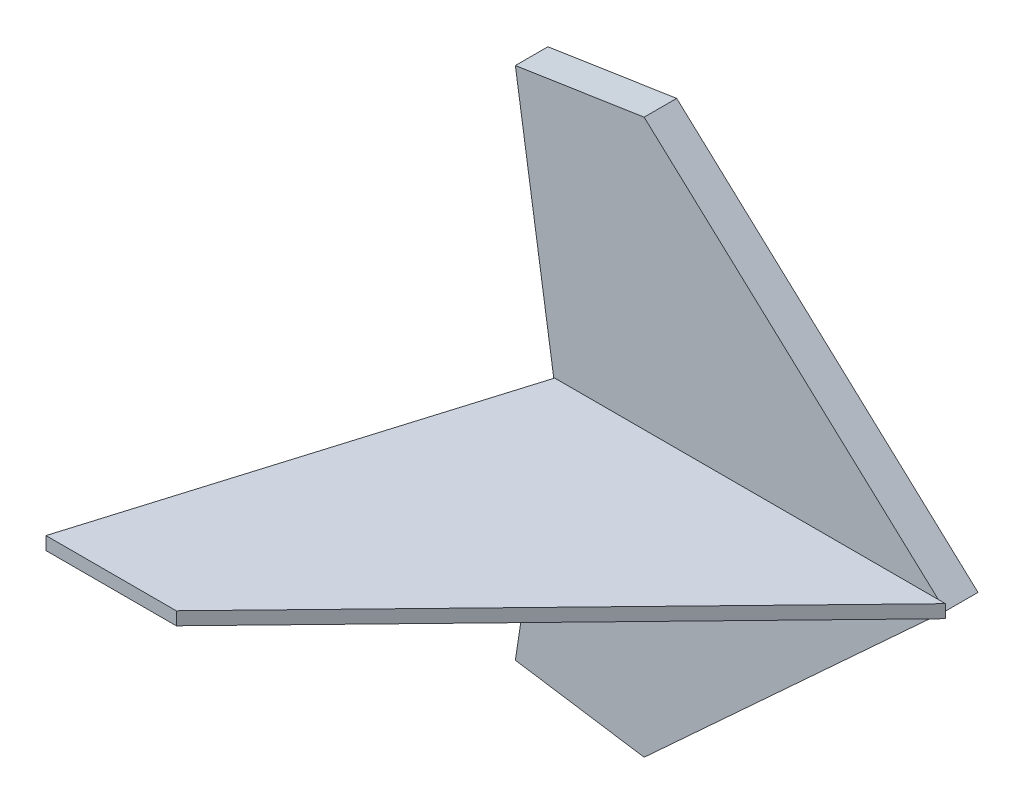
ISO-10303-21;
HEADER;
FILE_DESCRIPTION(('STEP AP214'),'2;1');
FILE_NAME('part.step','',(''),(''),'','','');
FILE_SCHEMA(('AUTOMOTIVE_DESIGN { 1 0 10303 214 1 1 1 1 }'));
ENDSEC;
DATA;
#1=APPLICATION_CONTEXT('core data for automotive mechanical design processes');
#2=APPLICATION_PROTOCOL_DEFINITION('international standard','automotive_design',2000,#1);
#3=PRODUCT_CONTEXT('',#1,'mechanical');
#4=PRODUCT('Part','Part','',(#3));
#5=PRODUCT_RELATED_PRODUCT_CATEGORY('part','',(#4));
#6=PRODUCT_DEFINITION_FORMATION('','',#4);
#7=PRODUCT_DEFINITION_CONTEXT('part definition',#1,'design');
#8=PRODUCT_DEFINITION('design','',#6,#7);
#9=PRODUCT_DEFINITION_SHAPE('','',#8);
#10=(LENGTH_UNIT() NAMED_UNIT(*) SI_UNIT(.MILLI.,.METRE.));
#11=(NAMED_UNIT(*) PLANE_ANGLE_UNIT() SI_UNIT($,.RADIAN.));
#12=(NAMED_UNIT(*) SI_UNIT($,.STERADIAN.) SOLID_ANGLE_UNIT());
#13=UNCERTAINTY_MEASURE_WITH_UNIT(LENGTH_MEASURE(1.E-05),#10,'distance_accuracy_value','');
#14=(GEOMETRIC_REPRESENTATION_CONTEXT(3) GLOBAL_UNCERTAINTY_ASSIGNED_CONTEXT((#13)) GLOBAL_UNIT_ASSIGNED_CONTEXT((#10,
#11,#12)) REPRESENTATION_CONTEXT('',''));
#15=CARTESIAN_POINT('',(0.,0.,0.));
#16=DIRECTION('',(0.,0.,1.));
#17=DIRECTION('',(1.,0.,0.));
#18=AXIS2_PLACEMENT_3D('',#15,#16,#17);
#19=CARTESIAN_POINT('',(-9.05423406871949,0.5,32.5));
#20=DIRECTION('',(0.,0.,-1.));
#21=DIRECTION('',(-1.,0.,0.));
#22=AXIS2_PLACEMENT_3D('',#19,#20,#21);
#23=PLANE('',#22);
#24=DIRECTION('',(1.,0.,0.));
#25=VECTOR('',#24,1.);
#26=CARTESIAN_POINT('',(-9.05423406871949,-0.5,32.5));
#27=LINE('',#26,#25);
#28=CARTESIAN_POINT('',(-9.05423406871949,-0.5,32.5));
#29=VERTEX_POINT('',#28);
#30=CARTESIAN_POINT('',(0.945765931280507,-0.5,32.5));
#31=VERTEX_POINT('',#30);
#32=EDGE_CURVE('E109',#29,#31,#27,.T.);
#33=ORIENTED_EDGE('',*,*,#32,.T.);
#34=DIRECTION('',(0.,-1.,0.));
#35=VECTOR('',#34,1.);
#36=CARTESIAN_POINT('',(0.945765931280507,0.5,32.5));
#37=LINE('',#36,#35);
#38=CARTESIAN_POINT('',(0.945765931280507,0.5,32.5));
#39=VERTEX_POINT('',#38);
#40=EDGE_CURVE('E12',#39,#31,#37,.T.);
#41=ORIENTED_EDGE('',*,*,#40,.F.);
#42=DIRECTION('',(1.,0.,0.));
#43=VECTOR('',#42,1.);
#44=CARTESIAN_POINT('',(-9.05423406871949,0.5,32.5));
#45=LINE('',#44,#43);
#46=CARTESIAN_POINT('',(-9.05423406871949,0.5,32.5));
#47=VERTEX_POINT('',#46);
#48=EDGE_CURVE('E97',#47,#39,#45,.T.);
#49=ORIENTED_EDGE('',*,*,#48,.F.);
#50=DIRECTION('',(0.,-1.,0.));
#51=VECTOR('',#50,1.);
#52=CARTESIAN_POINT('',(-9.05423406871949,0.5,32.5));
#53=LINE('',#52,#51);
#54=EDGE_CURVE('E105',#47,#29,#53,.T.);
#55=ORIENTED_EDGE('',*,*,#54,.T.);
#56=EDGE_LOOP('',(#33,#41,#49,#55));
#57=FACE_BOUND('',#56,.T.);
#58=ADVANCED_FACE('F46',(#57),#23,.F.);
#59=CARTESIAN_POINT('',(0.945765931280507,0.5,32.5));
#60=DIRECTION('',(-0.718339128041182,0.,-0.695693105560946));
#61=DIRECTION('',(-0.695693105560946,0.,0.718339128041182));
#62=AXIS2_PLACEMENT_3D('',#59,#60,#61);
#63=PLANE('',#62);
#64=DIRECTION('',(0.695693105560946,0.,-0.718339128041182));
#65=VECTOR('',#64,1.);
#66=CARTESIAN_POINT('',(0.945765931280507,-0.5,32.5));
#67=LINE('',#66,#65);
#68=CARTESIAN_POINT('',(30.,-0.5,2.5));
#69=VERTEX_POINT('',#68);
#70=EDGE_CURVE('E101',#31,#69,#67,.T.);
#71=ORIENTED_EDGE('',*,*,#70,.T.);
#72=DIRECTION('',(0.,-1.,0.));
#73=VECTOR('',#72,1.);
#74=CARTESIAN_POINT('',(30.,0.5,2.5));
#75=LINE('',#74,#73);
#76=CARTESIAN_POINT('',(30.,0.5,2.5));
#77=VERTEX_POINT('',#76);
#78=EDGE_CURVE('E54',#77,#69,#75,.T.);
#79=ORIENTED_EDGE('',*,*,#78,.F.);
#80=DIRECTION('',(0.695693105560946,0.,-0.718339128041182));
#81=VECTOR('',#80,1.);
#82=CARTESIAN_POINT('',(0.945765931280507,0.5,32.5));
#83=LINE('',#82,#81);
#84=EDGE_CURVE('E92',#39,#77,#83,.T.);
#85=ORIENTED_EDGE('',*,*,#84,.F.);
#86=ORIENTED_EDGE('',*,*,#40,.T.);
#87=EDGE_LOOP('',(#71,#79,#85,#86));
#88=FACE_BOUND('',#87,.T.);
#89=ADVANCED_FACE('F100',(#88),#63,.F.);
#90=CARTESIAN_POINT('',(0.,0.5,2.5));
#91=DIRECTION('',(0.,0.,1.));
#92=DIRECTION('',(1.,0.,0.));
#93=AXIS2_PLACEMENT_3D('',#90,#91,#92);
#94=PLANE('',#93);
#95=DIRECTION('',(-1.,0.,0.));
#96=VECTOR('',#95,1.);
#97=CARTESIAN_POINT('',(0.,-0.5,2.5));
#98=LINE('',#97,#96);
#99=CARTESIAN_POINT('',(0.,-0.5,2.5));
#100=VERTEX_POINT('',#99);
#101=EDGE_CURVE('E79',#69,#100,#98,.T.);
#102=ORIENTED_EDGE('',*,*,#101,.T.);
#103=DIRECTION('',(0.,-1.,0.));
#104=VECTOR('',#103,1.);
#105=CARTESIAN_POINT('',(0.,0.5,2.5));
#106=LINE('',#105,#104);
#107=CARTESIAN_POINT('',(0.,0.5,2.5));
#108=VERTEX_POINT('',#107);
#109=EDGE_CURVE('E102',#108,#100,#106,.T.);
#110=ORIENTED_EDGE('',*,*,#109,.F.);
#111=DIRECTION('',(-1.,0.,0.));
#112=VECTOR('',#111,1.);
#113=CARTESIAN_POINT('',(0.,0.5,2.5));
#114=LINE('',#113,#112);
#115=EDGE_CURVE('E95',#77,#108,#114,.T.);
#116=ORIENTED_EDGE('',*,*,#115,.F.);
#117=ORIENTED_EDGE('',*,*,#78,.T.);
#118=EDGE_LOOP('',(#102,#110,#116,#117));
#119=FACE_BOUND('',#118,.T.);
#120=ADVANCED_FACE('F103',(#119),#94,.F.);
#121=CARTESIAN_POINT('',(-9.05423406871949,0.5,32.5));
#122=DIRECTION('',(0.957348630533476,0.,0.288935286207272));
#123=DIRECTION('',(0.288935286207272,0.,-0.957348630533476));
#124=AXIS2_PLACEMENT_3D('',#121,#122,#123);
#125=PLANE('',#124);
#126=DIRECTION('',(-0.288935286207272,0.,0.957348630533476));
#127=VECTOR('',#126,1.);
#128=CARTESIAN_POINT('',(-9.05423406871949,-0.5,32.5));
#129=LINE('',#128,#127);
#130=EDGE_CURVE('E85',#100,#29,#129,.T.);
#131=ORIENTED_EDGE('',*,*,#130,.T.);
#132=ORIENTED_EDGE('',*,*,#54,.F.);
#133=DIRECTION('',(-0.288935286207272,0.,0.957348630533476));
#134=VECTOR('',#133,1.);
#135=CARTESIAN_POINT('',(-9.05423406871949,0.5,32.5));
#136=LINE('',#135,#134);
#137=EDGE_CURVE('E62',#108,#47,#136,.T.);
#138=ORIENTED_EDGE('',*,*,#137,.F.);
#139=ORIENTED_EDGE('',*,*,#109,.T.);
#140=EDGE_LOOP('',(#131,#132,#138,#139));
#141=FACE_BOUND('',#140,.T.);
#142=ADVANCED_FACE('F116',(#141),#125,.F.);
#143=CARTESIAN_POINT('',(0.,0.5,0.));
#144=DIRECTION('',(0.,1.,0.));
#145=DIRECTION('',(0.,0.,1.));
#146=AXIS2_PLACEMENT_3D('',#143,#144,#145);
#147=PLANE('',#146);
#148=ORIENTED_EDGE('',*,*,#48,.T.);
#149=ORIENTED_EDGE('',*,*,#84,.T.);
#150=ORIENTED_EDGE('',*,*,#115,.T.);
#151=ORIENTED_EDGE('',*,*,#137,.T.);
#152=EDGE_LOOP('',(#148,#149,#150,#151));
#153=FACE_BOUND('',#152,.T.);
#154=ADVANCED_FACE('F93',(#153),#147,.T.);
#155=CARTESIAN_POINT('',(0.,-0.5,0.));
#156=DIRECTION('',(0.,1.,0.));
#157=DIRECTION('',(0.,0.,1.));
#158=AXIS2_PLACEMENT_3D('',#155,#156,#157);
#159=PLANE('',#158);
#160=ORIENTED_EDGE('',*,*,#32,.F.);
#161=ORIENTED_EDGE('',*,*,#130,.F.);
#162=ORIENTED_EDGE('',*,*,#101,.F.);
#163=ORIENTED_EDGE('',*,*,#70,.F.);
#164=EDGE_LOOP('',(#160,#161,#162,#163));
#165=FACE_BOUND('',#164,.T.);
#166=ADVANCED_FACE('F119',(#165),#159,.F.);
#167=CLOSED_SHELL('',(#58,#89,#120,#142,#154,#166));
#168=MANIFOLD_SOLID_BREP('B2',#167);
#169=CARTESIAN_POINT('',(0.,0.,0.));
#170=DIRECTION('',(0.,0.,1.));
#171=DIRECTION('',(1.,0.,0.));
#172=AXIS2_PLACEMENT_3D('',#169,#170,#171);
#173=PLANE('',#172);
#174=DIRECTION('',(0.7359623733077,-0.677022440599496,0.));
#175=VECTOR('',#174,1.);
#176=CARTESIAN_POINT('',(13.7507815522589,14.9478912649853,0.));
#177=LINE('',#176,#175);
#178=CARTESIAN_POINT('',(6.86740634873216,21.2800077547306,0.));
#179=VERTEX_POINT('',#178);
#180=CARTESIAN_POINT('',(30.,0.,0.));
#181=VERTEX_POINT('',#180);
#182=EDGE_CURVE('E276',#179,#181,#177,.T.);
#183=ORIENTED_EDGE('',*,*,#182,.T.);
#184=DIRECTION('',(0.7359623733077,0.677022440599496,0.));
#185=VECTOR('',#184,1.);
#186=CARTESIAN_POINT('',(13.7507815522589,-14.9478912649853,0.));
#187=LINE('',#186,#185);
#188=CARTESIAN_POINT('',(6.86740634873216,-21.2800077547306,0.));
#189=VERTEX_POINT('',#188);
#190=EDGE_CURVE('E289',#189,#181,#187,.T.);
#191=ORIENTED_EDGE('',*,*,#190,.F.);
#192=DIRECTION('',(0.988548437163866,-0.150903901145325,0.));
#193=VECTOR('',#192,1.);
#194=CARTESIAN_POINT('',(-3.01807802290649,-19.7709687432773,0.));
#195=LINE('',#194,#193);
#196=CARTESIAN_POINT('',(-3.01807802290649,-19.7709687432773,0.));
#197=VERTEX_POINT('',#196);
#198=EDGE_CURVE('E309',#197,#189,#195,.T.);
#199=ORIENTED_EDGE('',*,*,#198,.F.);
#200=DIRECTION('',(-0.150903901145325,-0.988548437163866,0.));
#201=VECTOR('',#200,1.);
#202=CARTESIAN_POINT('',(0.,0.,0.));
#203=LINE('',#202,#201);
#204=CARTESIAN_POINT('',(0.,0.,0.));
#205=VERTEX_POINT('',#204);
#206=EDGE_CURVE('E307',#205,#197,#203,.T.);
#207=ORIENTED_EDGE('',*,*,#206,.F.);
#208=DIRECTION('',(-0.150903901145325,0.988548437163866,0.));
#209=VECTOR('',#208,1.);
#210=CARTESIAN_POINT('',(0.,0.,0.));
#211=LINE('',#210,#209);
#212=CARTESIAN_POINT('',(-3.01807802290649,19.7709687432773,0.));
#213=VERTEX_POINT('',#212);
#214=EDGE_CURVE('E304',#205,#213,#211,.T.);
#215=ORIENTED_EDGE('',*,*,#214,.T.);
#216=DIRECTION('',(0.988548437163866,0.150903901145325,0.));
#217=VECTOR('',#216,1.);
#218=CARTESIAN_POINT('',(-3.01807802290649,19.7709687432773,0.));
#219=LINE('',#218,#217);
#220=EDGE_CURVE('E279',#213,#179,#219,.T.);
#221=ORIENTED_EDGE('',*,*,#220,.T.);
#222=EDGE_LOOP('',(#183,#191,#199,#207,#215,#221));
#223=FACE_BOUND('',#222,.T.);
#224=DIRECTION('',(0.,1.,0.));
#225=VECTOR('',#224,1.);
#226=CARTESIAN_POINT('',(9.99806030040643,0.901972586646871,0.));
#227=LINE('',#226,#225);
#228=CARTESIAN_POINT('',(9.99806030040643,-1.09802741335313,0.));
#229=VERTEX_POINT('',#228);
#230=CARTESIAN_POINT('',(9.99806030040643,0.901972586646871,0.));
#231=VERTEX_POINT('',#230);
#232=EDGE_CURVE('E275',#229,#231,#227,.T.);
#233=ORIENTED_EDGE('',*,*,#232,.F.);
#234=DIRECTION('',(-1.,0.,0.));
#235=VECTOR('',#234,1.);
#236=CARTESIAN_POINT('',(11.9980603004064,-1.09802741335313,0.));
#237=LINE('',#236,#235);
#238=CARTESIAN_POINT('',(11.9980603004064,-1.09802741335313,0.));
#239=VERTEX_POINT('',#238);
#240=EDGE_CURVE('E272',#239,#229,#237,.T.);
#241=ORIENTED_EDGE('',*,*,#240,.F.);
#242=DIRECTION('',(0.,-1.,0.));
#243=VECTOR('',#242,1.);
#244=CARTESIAN_POINT('',(11.9980603004064,0.901972586646871,0.));
#245=LINE('',#244,#243);
#246=CARTESIAN_POINT('',(11.9980603004064,0.901972586646871,0.));
#247=VERTEX_POINT('',#246);
#248=EDGE_CURVE('E199',#247,#239,#245,.T.);
#249=ORIENTED_EDGE('',*,*,#248,.F.);
#250=DIRECTION('',(1.,0.,0.));
#251=VECTOR('',#250,1.);
#252=CARTESIAN_POINT('',(11.9980603004064,0.901972586646871,0.));
#253=LINE('',#252,#251);
#254=EDGE_CURVE('E194',#231,#247,#253,.T.);
#255=ORIENTED_EDGE('',*,*,#254,.F.);
#256=EDGE_LOOP('',(#233,#241,#249,#255));
#257=FACE_BOUND('',#256,.T.);
#258=ADVANCED_FACE('F179',(#223,#257),#173,.F.);
#259=CARTESIAN_POINT('',(13.7507815522589,14.9478912649853,2.5));
#260=DIRECTION('',(0.677022440599496,0.7359623733077,0.));
#261=DIRECTION('',(-0.7359623733077,0.677022440599496,0.));
#262=AXIS2_PLACEMENT_3D('',#259,#260,#261);
#263=PLANE('',#262);
#264=ORIENTED_EDGE('',*,*,#182,.F.);
#265=DIRECTION('',(0.,0.,-1.));
#266=VECTOR('',#265,1.);
#267=CARTESIAN_POINT('',(6.86740634873216,21.2800077547306,2.5));
#268=LINE('',#267,#266);
#269=CARTESIAN_POINT('',(6.86740634873216,21.2800077547306,2.5));
#270=VERTEX_POINT('',#269);
#271=EDGE_CURVE('E44',#270,#179,#268,.T.);
#272=ORIENTED_EDGE('',*,*,#271,.F.);
#273=DIRECTION('',(0.7359623733077,-0.677022440599496,0.));
#274=VECTOR('',#273,1.);
#275=CARTESIAN_POINT('',(13.7507815522589,14.9478912649853,2.5));
#276=LINE('',#275,#274);
#277=CARTESIAN_POINT('',(30.,0.,2.5));
#278=VERTEX_POINT('',#277);
#279=EDGE_CURVE('E285',#270,#278,#276,.T.);
#280=ORIENTED_EDGE('',*,*,#279,.T.);
#281=DIRECTION('',(0.,0.,-1.));
#282=VECTOR('',#281,1.);
#283=CARTESIAN_POINT('',(30.,0.,2.5));
#284=LINE('',#283,#282);
#285=EDGE_CURVE('E300',#278,#181,#284,.T.);
#286=ORIENTED_EDGE('',*,*,#285,.T.);
#287=EDGE_LOOP('',(#264,#272,#280,#286));
#288=FACE_BOUND('',#287,.T.);
#289=ADVANCED_FACE('F181',(#288),#263,.T.);
#290=CARTESIAN_POINT('',(-3.01807802290649,19.7709687432773,2.5));
#291=DIRECTION('',(-0.150903901145325,0.988548437163866,0.));
#292=DIRECTION('',(-0.988548437163866,-0.150903901145325,0.));
#293=AXIS2_PLACEMENT_3D('',#290,#291,#292);
#294=PLANE('',#293);
#295=ORIENTED_EDGE('',*,*,#220,.F.);
#296=DIRECTION('',(0.,0.,-1.));
#297=VECTOR('',#296,1.);
#298=CARTESIAN_POINT('',(-3.01807802290649,19.7709687432773,2.5));
#299=LINE('',#298,#297);
#300=CARTESIAN_POINT('',(-3.01807802290649,19.7709687432773,2.5));
#301=VERTEX_POINT('',#300);
#302=EDGE_CURVE('E187',#301,#213,#299,.T.);
#303=ORIENTED_EDGE('',*,*,#302,.F.);
#304=DIRECTION('',(0.988548437163866,0.150903901145325,0.));
#305=VECTOR('',#304,1.);
#306=CARTESIAN_POINT('',(-3.01807802290649,19.7709687432773,2.5));
#307=LINE('',#306,#305);
#308=EDGE_CURVE('E288',#301,#270,#307,.T.);
#309=ORIENTED_EDGE('',*,*,#308,.T.);
#310=ORIENTED_EDGE('',*,*,#271,.T.);
#311=EDGE_LOOP('',(#295,#303,#309,#310));
#312=FACE_BOUND('',#311,.T.);
#313=ADVANCED_FACE('F328',(#312),#294,.T.);
#314=CARTESIAN_POINT('',(0.,0.,2.5));
#315=DIRECTION('',(-0.988548437163866,-0.150903901145325,0.));
#316=DIRECTION('',(0.150903901145325,-0.988548437163866,0.));
#317=AXIS2_PLACEMENT_3D('',#314,#315,#316);
#318=PLANE('',#317);
#319=ORIENTED_EDGE('',*,*,#214,.F.);
#320=DIRECTION('',(0.,0.,-1.));
#321=VECTOR('',#320,1.);
#322=CARTESIAN_POINT('',(0.,0.,2.5));
#323=LINE('',#322,#321);
#324=CARTESIAN_POINT('',(0.,0.,2.5));
#325=VERTEX_POINT('',#324);
#326=EDGE_CURVE('E320',#325,#205,#323,.T.);
#327=ORIENTED_EDGE('',*,*,#326,.F.);
#328=DIRECTION('',(-0.150903901145325,0.988548437163866,0.));
#329=VECTOR('',#328,1.);
#330=CARTESIAN_POINT('',(0.,0.,2.5));
#331=LINE('',#330,#329);
#332=EDGE_CURVE('E292',#325,#301,#331,.T.);
#333=ORIENTED_EDGE('',*,*,#332,.T.);
#334=ORIENTED_EDGE('',*,*,#302,.T.);
#335=EDGE_LOOP('',(#319,#327,#333,#334));
#336=FACE_BOUND('',#335,.T.);
#337=ADVANCED_FACE('F324',(#336),#318,.T.);
#338=CARTESIAN_POINT('',(0.,0.,2.5));
#339=DIRECTION('',(0.988548437163866,-0.150903901145325,0.));
#340=DIRECTION('',(0.150903901145325,0.988548437163866,0.));
#341=AXIS2_PLACEMENT_3D('',#338,#339,#340);
#342=PLANE('',#341);
#343=ORIENTED_EDGE('',*,*,#206,.T.);
#344=DIRECTION('',(0.,0.,-1.));
#345=VECTOR('',#344,1.);
#346=CARTESIAN_POINT('',(-3.01807802290649,-19.7709687432773,2.5));
#347=LINE('',#346,#345);
#348=CARTESIAN_POINT('',(-3.01807802290649,-19.7709687432773,2.5));
#349=VERTEX_POINT('',#348);
#350=EDGE_CURVE('E317',#349,#197,#347,.T.);
#351=ORIENTED_EDGE('',*,*,#350,.F.);
#352=DIRECTION('',(-0.150903901145325,-0.988548437163866,0.));
#353=VECTOR('',#352,1.);
#354=CARTESIAN_POINT('',(0.,0.,2.5));
#355=LINE('',#354,#353);
#356=EDGE_CURVE('E295',#325,#349,#355,.T.);
#357=ORIENTED_EDGE('',*,*,#356,.F.);
#358=ORIENTED_EDGE('',*,*,#326,.T.);
#359=EDGE_LOOP('',(#343,#351,#357,#358));
#360=FACE_BOUND('',#359,.T.);
#361=ADVANCED_FACE('F336',(#360),#342,.F.);
#362=CARTESIAN_POINT('',(-3.01807802290649,-19.7709687432773,2.5));
#363=DIRECTION('',(0.150903901145325,0.988548437163866,0.));
#364=DIRECTION('',(-0.988548437163866,0.150903901145325,0.));
#365=AXIS2_PLACEMENT_3D('',#362,#363,#364);
#366=PLANE('',#365);
#367=ORIENTED_EDGE('',*,*,#198,.T.);
#368=DIRECTION('',(0.,0.,-1.));
#369=VECTOR('',#368,1.);
#370=CARTESIAN_POINT('',(6.86740634873216,-21.2800077547306,2.5));
#371=LINE('',#370,#369);
#372=CARTESIAN_POINT('',(6.86740634873216,-21.2800077547306,2.5));
#373=VERTEX_POINT('',#372);
#374=EDGE_CURVE('E314',#373,#189,#371,.T.);
#375=ORIENTED_EDGE('',*,*,#374,.F.);
#376=DIRECTION('',(0.988548437163866,-0.150903901145325,0.));
#377=VECTOR('',#376,1.);
#378=CARTESIAN_POINT('',(-3.01807802290649,-19.7709687432773,2.5));
#379=LINE('',#378,#377);
#380=EDGE_CURVE('E297',#349,#373,#379,.T.);
#381=ORIENTED_EDGE('',*,*,#380,.F.);
#382=ORIENTED_EDGE('',*,*,#350,.T.);
#383=EDGE_LOOP('',(#367,#375,#381,#382));
#384=FACE_BOUND('',#383,.T.);
#385=ADVANCED_FACE('F340',(#384),#366,.F.);
#386=CARTESIAN_POINT('',(13.7507815522589,-14.9478912649853,2.5));
#387=DIRECTION('',(-0.677022440599496,0.7359623733077,0.));
#388=DIRECTION('',(-0.7359623733077,-0.677022440599496,0.));
#389=AXIS2_PLACEMENT_3D('',#386,#387,#388);
#390=PLANE('',#389);
#391=ORIENTED_EDGE('',*,*,#190,.T.);
#392=ORIENTED_EDGE('',*,*,#285,.F.);
#393=DIRECTION('',(0.7359623733077,0.677022440599496,0.));
#394=VECTOR('',#393,1.);
#395=CARTESIAN_POINT('',(13.7507815522589,-14.9478912649853,2.5));
#396=LINE('',#395,#394);
#397=EDGE_CURVE('E299',#373,#278,#396,.T.);
#398=ORIENTED_EDGE('',*,*,#397,.F.);
#399=ORIENTED_EDGE('',*,*,#374,.T.);
#400=EDGE_LOOP('',(#391,#392,#398,#399));
#401=FACE_BOUND('',#400,.T.);
#402=ADVANCED_FACE('F349',(#401),#390,.F.);
#403=CARTESIAN_POINT('',(0.,0.,2.5));
#404=DIRECTION('',(0.,0.,1.));
#405=DIRECTION('',(1.,0.,0.));
#406=AXIS2_PLACEMENT_3D('',#403,#404,#405);
#407=PLANE('',#406);
#408=ORIENTED_EDGE('',*,*,#279,.F.);
#409=ORIENTED_EDGE('',*,*,#308,.F.);
#410=ORIENTED_EDGE('',*,*,#332,.F.);
#411=ORIENTED_EDGE('',*,*,#356,.T.);
#412=ORIENTED_EDGE('',*,*,#380,.T.);
#413=ORIENTED_EDGE('',*,*,#397,.T.);
#414=EDGE_LOOP('',(#408,#409,#410,#411,#412,#413));
#415=FACE_BOUND('',#414,.T.);
#416=ADVANCED_FACE('F345',(#415),#407,.T.);
#417=CARTESIAN_POINT('',(9.99806030040643,0.901972586646871,-7.50000000000001));
#418=DIRECTION('',(1.,0.,0.));
#419=DIRECTION('',(0.,0.,-1.));
#420=AXIS2_PLACEMENT_3D('',#417,#418,#419);
#421=PLANE('',#420);
#422=ORIENTED_EDGE('',*,*,#232,.T.);
#423=DIRECTION('',(0.,0.,1.));
#424=VECTOR('',#423,1.);
#425=CARTESIAN_POINT('',(9.99806030040643,0.901972586646871,-7.50000000000001));
#426=LINE('',#425,#424);
#427=CARTESIAN_POINT('',(9.99806030040643,0.901972586646871,-7.50000000000001));
#428=VERTEX_POINT('',#427);
#429=EDGE_CURVE('E256',#428,#231,#426,.T.);
#430=ORIENTED_EDGE('',*,*,#429,.F.);
#431=DIRECTION('',(0.,1.,0.));
#432=VECTOR('',#431,1.);
#433=CARTESIAN_POINT('',(9.99806030040643,0.901972586646871,-7.50000000000001));
#434=LINE('',#433,#432);
#435=CARTESIAN_POINT('',(9.99806030040643,-1.09802741335313,-7.50000000000001));
#436=VERTEX_POINT('',#435);
#437=EDGE_CURVE('E263',#436,#428,#434,.T.);
#438=ORIENTED_EDGE('',*,*,#437,.F.);
#439=DIRECTION('',(0.,0.,1.));
#440=VECTOR('',#439,1.);
#441=CARTESIAN_POINT('',(9.99806030040643,-1.09802741335313,-7.50000000000001));
#442=LINE('',#441,#440);
#443=EDGE_CURVE('E464',#436,#229,#442,.T.);
#444=ORIENTED_EDGE('',*,*,#443,.T.);
#445=EDGE_LOOP('',(#422,#430,#438,#444));
#446=FACE_BOUND('',#445,.T.);
#447=ADVANCED_FACE('F274',(#446),#421,.F.);
#448=CARTESIAN_POINT('',(11.9980603004064,0.901972586646871,-7.50000000000001));
#449=DIRECTION('',(0.,-1.,0.));
#450=DIRECTION('',(0.,0.,-1.));
#451=AXIS2_PLACEMENT_3D('',#448,#449,#450);
#452=PLANE('',#451);
#453=ORIENTED_EDGE('',*,*,#254,.T.);
#454=DIRECTION('',(0.,0.,1.));
#455=VECTOR('',#454,1.);
#456=CARTESIAN_POINT('',(11.9980603004064,0.901972586646871,-7.50000000000001));
#457=LINE('',#456,#455);
#458=CARTESIAN_POINT('',(11.9980603004064,0.901972586646871,-7.50000000000001));
#459=VERTEX_POINT('',#458);
#460=EDGE_CURVE('E259',#459,#247,#457,.T.);
#461=ORIENTED_EDGE('',*,*,#460,.F.);
#462=DIRECTION('',(1.,0.,0.));
#463=VECTOR('',#462,1.);
#464=CARTESIAN_POINT('',(11.9980603004064,0.901972586646871,-7.50000000000001));
#465=LINE('',#464,#463);
#466=EDGE_CURVE('E252',#428,#459,#465,.T.);
#467=ORIENTED_EDGE('',*,*,#466,.F.);
#468=ORIENTED_EDGE('',*,*,#429,.T.);
#469=EDGE_LOOP('',(#453,#461,#467,#468));
#470=FACE_BOUND('',#469,.T.);
#471=ADVANCED_FACE('F254',(#470),#452,.F.);
#472=CARTESIAN_POINT('',(11.9980603004064,0.901972586646871,-7.50000000000001));
#473=DIRECTION('',(-1.,0.,0.));
#474=DIRECTION('',(0.,0.,1.));
#475=AXIS2_PLACEMENT_3D('',#472,#473,#474);
#476=PLANE('',#475);
#477=ORIENTED_EDGE('',*,*,#248,.T.);
#478=DIRECTION('',(0.,0.,1.));
#479=VECTOR('',#478,1.);
#480=CARTESIAN_POINT('',(11.9980603004064,-1.09802741335313,-7.50000000000001));
#481=LINE('',#480,#479);
#482=CARTESIAN_POINT('',(11.9980603004064,-1.09802741335313,-7.50000000000001));
#483=VERTEX_POINT('',#482);
#484=EDGE_CURVE('E281',#483,#239,#481,.T.);
#485=ORIENTED_EDGE('',*,*,#484,.F.);
#486=DIRECTION('',(0.,-1.,0.));
#487=VECTOR('',#486,1.);
#488=CARTESIAN_POINT('',(11.9980603004064,0.901972586646871,-7.50000000000001));
#489=LINE('',#488,#487);
#490=EDGE_CURVE('E262',#459,#483,#489,.T.);
#491=ORIENTED_EDGE('',*,*,#490,.F.);
#492=ORIENTED_EDGE('',*,*,#460,.T.);
#493=EDGE_LOOP('',(#477,#485,#491,#492));
#494=FACE_BOUND('',#493,.T.);
#495=ADVANCED_FACE('F368',(#494),#476,.F.);
#496=CARTESIAN_POINT('',(11.9980603004064,-1.09802741335313,-7.50000000000001));
#497=DIRECTION('',(0.,1.,0.));
#498=DIRECTION('',(0.,0.,1.));
#499=AXIS2_PLACEMENT_3D('',#496,#497,#498);
#500=PLANE('',#499);
#501=ORIENTED_EDGE('',*,*,#240,.T.);
#502=ORIENTED_EDGE('',*,*,#443,.F.);
#503=DIRECTION('',(-1.,0.,0.));
#504=VECTOR('',#503,1.);
#505=CARTESIAN_POINT('',(11.9980603004064,-1.09802741335313,-7.50000000000001));
#506=LINE('',#505,#504);
#507=EDGE_CURVE('E268',#483,#436,#506,.T.);
#508=ORIENTED_EDGE('',*,*,#507,.F.);
#509=ORIENTED_EDGE('',*,*,#484,.T.);
#510=EDGE_LOOP('',(#501,#502,#508,#509));
#511=FACE_BOUND('',#510,.T.);
#512=ADVANCED_FACE('F371',(#511),#500,.F.);
#513=CARTESIAN_POINT('',(0.,0.,-7.50000000000001));
#514=DIRECTION('',(0.,0.,-1.));
#515=DIRECTION('',(-1.,0.,0.));
#516=AXIS2_PLACEMENT_3D('',#513,#514,#515);
#517=PLANE('',#516);
#518=ORIENTED_EDGE('',*,*,#437,.T.);
#519=ORIENTED_EDGE('',*,*,#466,.T.);
#520=ORIENTED_EDGE('',*,*,#490,.T.);
#521=ORIENTED_EDGE('',*,*,#507,.T.);
#522=EDGE_LOOP('',(#518,#519,#520,#521));
#523=FACE_BOUND('',#522,.T.);
#524=ADVANCED_FACE('F266',(#523),#517,.T.);
#525=CLOSED_SHELL('',(#258,#289,#313,#337,#361,#385,#402,#416,#447,#471,#495,#512,#524));
#526=MANIFOLD_SOLID_BREP('B6',#525);
#527=ADVANCED_BREP_SHAPE_REPRESENTATION('',(#18,#168,#526),#14);
#528=SHAPE_DEFINITION_REPRESENTATION(#9,#527);
ENDSEC;
END-ISO-10303-21;
